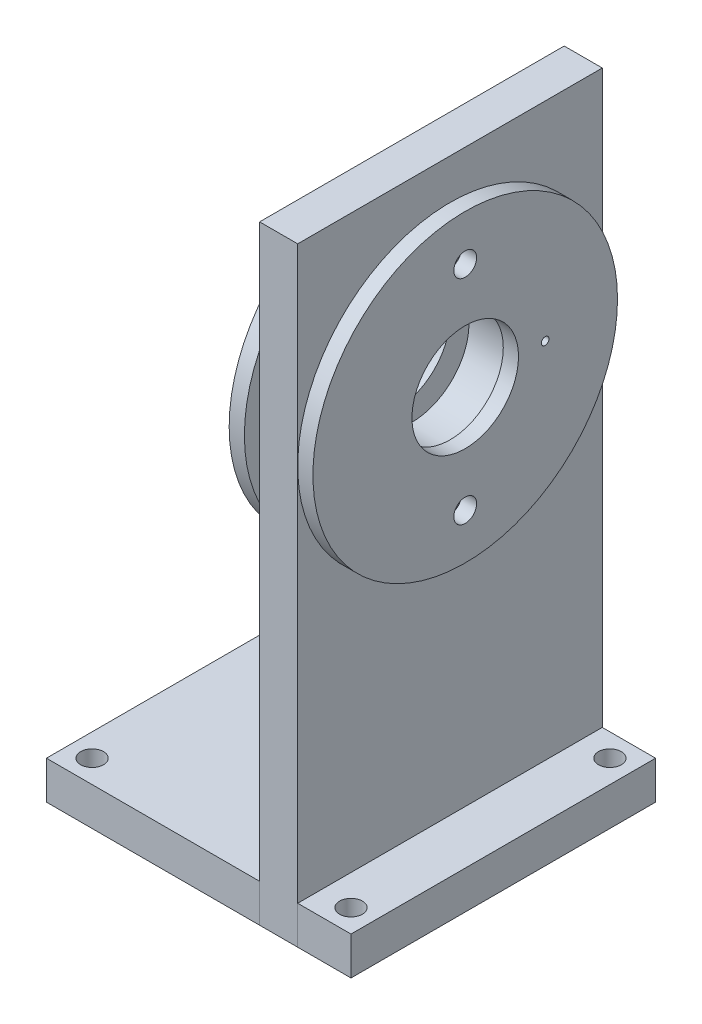
ISO-10303-21;
HEADER;
FILE_DESCRIPTION(('STEP AP214'),'2;1');
FILE_NAME('part.step','',(''),(''),'','','');
FILE_SCHEMA(('AUTOMOTIVE_DESIGN { 1 0 10303 214 1 1 1 1 }'));
ENDSEC;
DATA;
#1=APPLICATION_CONTEXT('core data for automotive mechanical design processes');
#2=APPLICATION_PROTOCOL_DEFINITION('international standard','automotive_design',2000,#1);
#3=PRODUCT_CONTEXT('',#1,'mechanical');
#4=PRODUCT('Part','Part','',(#3));
#5=PRODUCT_RELATED_PRODUCT_CATEGORY('part','',(#4));
#6=PRODUCT_DEFINITION_FORMATION('','',#4);
#7=PRODUCT_DEFINITION_CONTEXT('part definition',#1,'design');
#8=PRODUCT_DEFINITION('design','',#6,#7);
#9=PRODUCT_DEFINITION_SHAPE('','',#8);
#10=(LENGTH_UNIT() NAMED_UNIT(*) SI_UNIT(.MILLI.,.METRE.));
#11=(NAMED_UNIT(*) PLANE_ANGLE_UNIT() SI_UNIT($,.RADIAN.));
#12=(NAMED_UNIT(*) SI_UNIT($,.STERADIAN.) SOLID_ANGLE_UNIT());
#13=UNCERTAINTY_MEASURE_WITH_UNIT(LENGTH_MEASURE(1.E-05),#10,'distance_accuracy_value','');
#14=(GEOMETRIC_REPRESENTATION_CONTEXT(3) GLOBAL_UNCERTAINTY_ASSIGNED_CONTEXT((#13)) GLOBAL_UNIT_ASSIGNED_CONTEXT((#10,
#11,#12)) REPRESENTATION_CONTEXT('',''));
#15=CARTESIAN_POINT('',(0.,0.,0.));
#16=DIRECTION('',(0.,0.,1.));
#17=DIRECTION('',(1.,0.,0.));
#18=AXIS2_PLACEMENT_3D('',#15,#16,#17);
#19=CARTESIAN_POINT('',(0.,5.,20.));
#20=DIRECTION('',(0.,0.,1.));
#21=DIRECTION('',(0.,-1.,0.));
#22=AXIS2_PLACEMENT_3D('',#19,#20,#21);
#23=PLANE('',#22);
#24=DIRECTION('',(-1.,0.,0.));
#25=VECTOR('',#24,1.);
#26=CARTESIAN_POINT('',(0.,0.,20.));
#27=LINE('',#26,#25);
#28=CARTESIAN_POINT('',(12.,0.,20.));
#29=VERTEX_POINT('',#28);
#30=CARTESIAN_POINT('',(-28.,0.,20.));
#31=VERTEX_POINT('',#30);
#32=EDGE_CURVE('E158',#29,#31,#27,.T.);
#33=ORIENTED_EDGE('',*,*,#32,.F.);
#34=DIRECTION('',(0.,-1.,0.));
#35=VECTOR('',#34,1.);
#36=CARTESIAN_POINT('',(12.,5.,20.));
#37=LINE('',#36,#35);
#38=CARTESIAN_POINT('',(12.,5.,20.));
#39=VERTEX_POINT('',#38);
#40=EDGE_CURVE('E12',#39,#29,#37,.T.);
#41=ORIENTED_EDGE('',*,*,#40,.F.);
#42=DIRECTION('',(-1.,0.,0.));
#43=VECTOR('',#42,1.);
#44=CARTESIAN_POINT('',(-28.,5.,20.));
#45=LINE('',#44,#43);
#46=CARTESIAN_POINT('',(-28.,5.,20.));
#47=VERTEX_POINT('',#46);
#48=EDGE_CURVE('E154',#39,#47,#45,.T.);
#49=ORIENTED_EDGE('',*,*,#48,.T.);
#50=DIRECTION('',(0.,-1.,0.));
#51=VECTOR('',#50,1.);
#52=CARTESIAN_POINT('',(-28.,5.,20.));
#53=LINE('',#52,#51);
#54=EDGE_CURVE('E45',#47,#31,#53,.T.);
#55=ORIENTED_EDGE('',*,*,#54,.T.);
#56=EDGE_LOOP('',(#33,#41,#49,#55));
#57=FACE_BOUND('',#56,.T.);
#58=ADVANCED_FACE('F41',(#57),#23,.T.);
#59=CARTESIAN_POINT('',(12.,5.,20.));
#60=DIRECTION('',(1.,0.,0.));
#61=DIRECTION('',(0.,0.,-1.));
#62=AXIS2_PLACEMENT_3D('',#59,#60,#61);
#63=PLANE('',#62);
#64=DIRECTION('',(0.,0.,1.));
#65=VECTOR('',#64,1.);
#66=CARTESIAN_POINT('',(12.,0.,20.));
#67=LINE('',#66,#65);
#68=CARTESIAN_POINT('',(12.,0.,-20.));
#69=VERTEX_POINT('',#68);
#70=EDGE_CURVE('E172',#69,#29,#67,.T.);
#71=ORIENTED_EDGE('',*,*,#70,.F.);
#72=DIRECTION('',(0.,-1.,0.));
#73=VECTOR('',#72,1.);
#74=CARTESIAN_POINT('',(12.,5.,-20.));
#75=LINE('',#74,#73);
#76=CARTESIAN_POINT('',(12.,5.,-20.));
#77=VERTEX_POINT('',#76);
#78=EDGE_CURVE('E50',#77,#69,#75,.T.);
#79=ORIENTED_EDGE('',*,*,#78,.F.);
#80=DIRECTION('',(0.,0.,1.));
#81=VECTOR('',#80,1.);
#82=CARTESIAN_POINT('',(12.,5.,20.));
#83=LINE('',#82,#81);
#84=EDGE_CURVE('E164',#77,#39,#83,.T.);
#85=ORIENTED_EDGE('',*,*,#84,.T.);
#86=ORIENTED_EDGE('',*,*,#40,.T.);
#87=EDGE_LOOP('',(#71,#79,#85,#86));
#88=FACE_BOUND('',#87,.T.);
#89=ADVANCED_FACE('F189',(#88),#63,.T.);
#90=CARTESIAN_POINT('',(12.,5.,-20.));
#91=DIRECTION('',(0.,0.,-1.));
#92=DIRECTION('',(-1.,0.,0.));
#93=AXIS2_PLACEMENT_3D('',#90,#91,#92);
#94=PLANE('',#93);
#95=DIRECTION('',(1.,0.,0.));
#96=VECTOR('',#95,1.);
#97=CARTESIAN_POINT('',(12.,0.,-20.));
#98=LINE('',#97,#96);
#99=CARTESIAN_POINT('',(-28.,0.,-20.));
#100=VERTEX_POINT('',#99);
#101=EDGE_CURVE('E169',#100,#69,#98,.T.);
#102=ORIENTED_EDGE('',*,*,#101,.F.);
#103=DIRECTION('',(0.,-1.,0.));
#104=VECTOR('',#103,1.);
#105=CARTESIAN_POINT('',(-28.,5.,-20.));
#106=LINE('',#105,#104);
#107=CARTESIAN_POINT('',(-28.,5.,-20.));
#108=VERTEX_POINT('',#107);
#109=EDGE_CURVE('E176',#108,#100,#106,.T.);
#110=ORIENTED_EDGE('',*,*,#109,.F.);
#111=DIRECTION('',(1.,0.,0.));
#112=VECTOR('',#111,1.);
#113=CARTESIAN_POINT('',(12.,5.,-20.));
#114=LINE('',#113,#112);
#115=EDGE_CURVE('E161',#108,#77,#114,.T.);
#116=ORIENTED_EDGE('',*,*,#115,.T.);
#117=ORIENTED_EDGE('',*,*,#78,.T.);
#118=EDGE_LOOP('',(#102,#110,#116,#117));
#119=FACE_BOUND('',#118,.T.);
#120=ADVANCED_FACE('F194',(#119),#94,.T.);
#121=CARTESIAN_POINT('',(-28.,5.,-20.));
#122=DIRECTION('',(-1.,0.,0.));
#123=DIRECTION('',(0.,0.,1.));
#124=AXIS2_PLACEMENT_3D('',#121,#122,#123);
#125=PLANE('',#124);
#126=DIRECTION('',(0.,0.,-1.));
#127=VECTOR('',#126,1.);
#128=CARTESIAN_POINT('',(-28.,0.,-20.));
#129=LINE('',#128,#127);
#130=EDGE_CURVE('E151',#31,#100,#129,.T.);
#131=ORIENTED_EDGE('',*,*,#130,.F.);
#132=ORIENTED_EDGE('',*,*,#54,.F.);
#133=DIRECTION('',(0.,0.,-1.));
#134=VECTOR('',#133,1.);
#135=CARTESIAN_POINT('',(-28.,5.,-20.));
#136=LINE('',#135,#134);
#137=EDGE_CURVE('E157',#47,#108,#136,.T.);
#138=ORIENTED_EDGE('',*,*,#137,.T.);
#139=ORIENTED_EDGE('',*,*,#109,.T.);
#140=EDGE_LOOP('',(#131,#132,#138,#139));
#141=FACE_BOUND('',#140,.T.);
#142=ADVANCED_FACE('F43',(#141),#125,.T.);
#143=CARTESIAN_POINT('',(0.,5.,0.));
#144=DIRECTION('',(0.,1.,0.));
#145=DIRECTION('',(0.,0.,1.));
#146=AXIS2_PLACEMENT_3D('',#143,#144,#145);
#147=PLANE('',#146);
#148=CARTESIAN_POINT('',(9.00000000000001,5.,17.));
#149=DIRECTION('',(0.,-1.,0.));
#150=DIRECTION('',(0.,0.,1.));
#151=AXIS2_PLACEMENT_3D('',#148,#149,#150);
#152=CIRCLE('',#151,1.5);
#153=CARTESIAN_POINT('',(9.00000000000001,5.,18.5));
#154=VERTEX_POINT('',#153);
#155=EDGE_CURVE('E243',#154,#154,#152,.T.);
#156=ORIENTED_EDGE('',*,*,#155,.T.);
#157=EDGE_LOOP('',(#156));
#158=FACE_BOUND('',#157,.T.);
#159=CARTESIAN_POINT('',(9.,5.,-17.));
#160=DIRECTION('',(0.,-1.,0.));
#161=DIRECTION('',(0.,0.,-1.));
#162=AXIS2_PLACEMENT_3D('',#159,#160,#161);
#163=CIRCLE('',#162,1.5);
#164=CARTESIAN_POINT('',(9.,5.,-18.5));
#165=VERTEX_POINT('',#164);
#166=EDGE_CURVE('E251',#165,#165,#163,.T.);
#167=ORIENTED_EDGE('',*,*,#166,.T.);
#168=EDGE_LOOP('',(#167));
#169=FACE_BOUND('',#168,.T.);
#170=CARTESIAN_POINT('',(-25.,5.,-17.));
#171=DIRECTION('',(0.,-1.,0.));
#172=DIRECTION('',(0.,0.,1.));
#173=AXIS2_PLACEMENT_3D('',#170,#171,#172);
#174=CIRCLE('',#173,1.5);
#175=CARTESIAN_POINT('',(-25.,5.,-15.5));
#176=VERTEX_POINT('',#175);
#177=EDGE_CURVE('E138',#176,#176,#174,.T.);
#178=ORIENTED_EDGE('',*,*,#177,.T.);
#179=EDGE_LOOP('',(#178));
#180=FACE_BOUND('',#179,.T.);
#181=DIRECTION('',(-1.,0.,0.));
#182=VECTOR('',#181,1.);
#183=CARTESIAN_POINT('',(5.,5.,7.));
#184=LINE('',#183,#182);
#185=CARTESIAN_POINT('',(5.,5.,7.));
#186=VERTEX_POINT('',#185);
#187=CARTESIAN_POINT('',(0.,5.,7.));
#188=VERTEX_POINT('',#187);
#189=EDGE_CURVE('E109',#186,#188,#184,.T.);
#190=ORIENTED_EDGE('',*,*,#189,.T.);
#191=DIRECTION('',(0.,0.,-1.));
#192=VECTOR('',#191,1.);
#193=CARTESIAN_POINT('',(0.,5.,7.));
#194=LINE('',#193,#192);
#195=CARTESIAN_POINT('',(0.,5.,-7.));
#196=VERTEX_POINT('',#195);
#197=EDGE_CURVE('E118',#188,#196,#194,.T.);
#198=ORIENTED_EDGE('',*,*,#197,.T.);
#199=DIRECTION('',(1.,0.,0.));
#200=VECTOR('',#199,1.);
#201=CARTESIAN_POINT('',(0.,5.,-7.));
#202=LINE('',#201,#200);
#203=CARTESIAN_POINT('',(5.,5.,-7.));
#204=VERTEX_POINT('',#203);
#205=EDGE_CURVE('E58',#196,#204,#202,.T.);
#206=ORIENTED_EDGE('',*,*,#205,.T.);
#207=DIRECTION('',(0.,0.,1.));
#208=VECTOR('',#207,1.);
#209=CARTESIAN_POINT('',(5.,5.,-7.));
#210=LINE('',#209,#208);
#211=EDGE_CURVE('E115',#204,#186,#210,.T.);
#212=ORIENTED_EDGE('',*,*,#211,.T.);
#213=EDGE_LOOP('',(#190,#198,#206,#212));
#214=FACE_BOUND('',#213,.T.);
#215=CARTESIAN_POINT('',(-25.,5.,17.));
#216=DIRECTION('',(0.,-1.,0.));
#217=DIRECTION('',(0.,0.,-1.));
#218=AXIS2_PLACEMENT_3D('',#215,#216,#217);
#219=CIRCLE('',#218,1.5);
#220=CARTESIAN_POINT('',(-25.,5.,15.5));
#221=VERTEX_POINT('',#220);
#222=EDGE_CURVE('E148',#221,#221,#219,.T.);
#223=ORIENTED_EDGE('',*,*,#222,.T.);
#224=EDGE_LOOP('',(#223));
#225=FACE_BOUND('',#224,.T.);
#226=ORIENTED_EDGE('',*,*,#48,.F.);
#227=ORIENTED_EDGE('',*,*,#84,.F.);
#228=ORIENTED_EDGE('',*,*,#115,.F.);
#229=ORIENTED_EDGE('',*,*,#137,.F.);
#230=EDGE_LOOP('',(#226,#227,#228,#229));
#231=FACE_BOUND('',#230,.T.);
#232=ADVANCED_FACE('F122',(#158,#169,#180,#214,#225,#231),#147,.T.);
#233=CARTESIAN_POINT('',(0.,0.,0.));
#234=DIRECTION('',(0.,1.,0.));
#235=DIRECTION('',(0.,0.,1.));
#236=AXIS2_PLACEMENT_3D('',#233,#234,#235);
#237=PLANE('',#236);
#238=CARTESIAN_POINT('',(9.00000000000001,0.,17.));
#239=DIRECTION('',(0.,-1.,0.));
#240=DIRECTION('',(0.,0.,1.));
#241=AXIS2_PLACEMENT_3D('',#238,#239,#240);
#242=CIRCLE('',#241,1.5);
#243=CARTESIAN_POINT('',(9.00000000000001,0.,18.5));
#244=VERTEX_POINT('',#243);
#245=EDGE_CURVE('E246',#244,#244,#242,.T.);
#246=ORIENTED_EDGE('',*,*,#245,.F.);
#247=EDGE_LOOP('',(#246));
#248=FACE_BOUND('',#247,.T.);
#249=CARTESIAN_POINT('',(9.,0.,-17.));
#250=DIRECTION('',(0.,-1.,0.));
#251=DIRECTION('',(0.,0.,-1.));
#252=AXIS2_PLACEMENT_3D('',#249,#250,#251);
#253=CIRCLE('',#252,1.5);
#254=CARTESIAN_POINT('',(9.,0.,-18.5));
#255=VERTEX_POINT('',#254);
#256=EDGE_CURVE('E248',#255,#255,#253,.T.);
#257=ORIENTED_EDGE('',*,*,#256,.F.);
#258=EDGE_LOOP('',(#257));
#259=FACE_BOUND('',#258,.T.);
#260=CARTESIAN_POINT('',(-25.,0.,-17.));
#261=DIRECTION('',(0.,-1.,0.));
#262=DIRECTION('',(0.,0.,1.));
#263=AXIS2_PLACEMENT_3D('',#260,#261,#262);
#264=CIRCLE('',#263,1.5);
#265=CARTESIAN_POINT('',(-25.,0.,-15.5));
#266=VERTEX_POINT('',#265);
#267=EDGE_CURVE('E131',#266,#266,#264,.T.);
#268=ORIENTED_EDGE('',*,*,#267,.F.);
#269=EDGE_LOOP('',(#268));
#270=FACE_BOUND('',#269,.T.);
#271=DIRECTION('',(0.,0.,-1.));
#272=VECTOR('',#271,1.);
#273=CARTESIAN_POINT('',(0.,0.,7.));
#274=LINE('',#273,#272);
#275=CARTESIAN_POINT('',(0.,0.,7.));
#276=VERTEX_POINT('',#275);
#277=CARTESIAN_POINT('',(0.,0.,-7.));
#278=VERTEX_POINT('',#277);
#279=EDGE_CURVE('E137',#276,#278,#274,.T.);
#280=ORIENTED_EDGE('',*,*,#279,.F.);
#281=DIRECTION('',(-1.,0.,0.));
#282=VECTOR('',#281,1.);
#283=CARTESIAN_POINT('',(5.,0.,7.));
#284=LINE('',#283,#282);
#285=CARTESIAN_POINT('',(5.,0.,7.));
#286=VERTEX_POINT('',#285);
#287=EDGE_CURVE('E66',#286,#276,#284,.T.);
#288=ORIENTED_EDGE('',*,*,#287,.F.);
#289=DIRECTION('',(0.,0.,1.));
#290=VECTOR('',#289,1.);
#291=CARTESIAN_POINT('',(5.,0.,-7.));
#292=LINE('',#291,#290);
#293=CARTESIAN_POINT('',(5.,0.,-7.));
#294=VERTEX_POINT('',#293);
#295=EDGE_CURVE('E125',#294,#286,#292,.T.);
#296=ORIENTED_EDGE('',*,*,#295,.F.);
#297=DIRECTION('',(1.,0.,0.));
#298=VECTOR('',#297,1.);
#299=CARTESIAN_POINT('',(0.,0.,-7.));
#300=LINE('',#299,#298);
#301=EDGE_CURVE('E128',#278,#294,#300,.T.);
#302=ORIENTED_EDGE('',*,*,#301,.F.);
#303=EDGE_LOOP('',(#280,#288,#296,#302));
#304=FACE_BOUND('',#303,.T.);
#305=CARTESIAN_POINT('',(-25.,0.,17.));
#306=DIRECTION('',(0.,-1.,0.));
#307=DIRECTION('',(0.,0.,-1.));
#308=AXIS2_PLACEMENT_3D('',#305,#306,#307);
#309=CIRCLE('',#308,1.5);
#310=CARTESIAN_POINT('',(-25.,0.,15.5));
#311=VERTEX_POINT('',#310);
#312=EDGE_CURVE('E144',#311,#311,#309,.T.);
#313=ORIENTED_EDGE('',*,*,#312,.F.);
#314=EDGE_LOOP('',(#313));
#315=FACE_BOUND('',#314,.T.);
#316=ORIENTED_EDGE('',*,*,#32,.T.);
#317=ORIENTED_EDGE('',*,*,#130,.T.);
#318=ORIENTED_EDGE('',*,*,#101,.T.);
#319=ORIENTED_EDGE('',*,*,#70,.T.);
#320=EDGE_LOOP('',(#316,#317,#318,#319));
#321=FACE_BOUND('',#320,.T.);
#322=ADVANCED_FACE('F186',(#248,#259,#270,#304,#315,#321),#237,.F.);
#323=CARTESIAN_POINT('',(-25.,5.,17.));
#324=DIRECTION('',(0.,-1.,0.));
#325=DIRECTION('',(0.,0.,-1.));
#326=AXIS2_PLACEMENT_3D('',#323,#324,#325);
#327=CYLINDRICAL_SURFACE('',#326,1.5);
#328=ORIENTED_EDGE('',*,*,#222,.F.);
#329=EDGE_LOOP('',(#328));
#330=FACE_BOUND('',#329,.T.);
#331=ORIENTED_EDGE('',*,*,#312,.T.);
#332=EDGE_LOOP('',(#331));
#333=FACE_BOUND('',#332,.T.);
#334=ADVANCED_FACE('F208',(#330,#333),#327,.F.);
#335=CARTESIAN_POINT('',(5.,5.,7.));
#336=DIRECTION('',(0.,0.,1.));
#337=DIRECTION('',(1.,0.,0.));
#338=AXIS2_PLACEMENT_3D('',#335,#336,#337);
#339=PLANE('',#338);
#340=ORIENTED_EDGE('',*,*,#287,.T.);
#341=DIRECTION('',(0.,-1.,0.));
#342=VECTOR('',#341,1.);
#343=CARTESIAN_POINT('',(0.,5.,7.));
#344=LINE('',#343,#342);
#345=EDGE_CURVE('E105',#188,#276,#344,.T.);
#346=ORIENTED_EDGE('',*,*,#345,.F.);
#347=ORIENTED_EDGE('',*,*,#189,.F.);
#348=DIRECTION('',(0.,-1.,0.));
#349=VECTOR('',#348,1.);
#350=CARTESIAN_POINT('',(5.,5.,7.));
#351=LINE('',#350,#349);
#352=EDGE_CURVE('E142',#186,#286,#351,.T.);
#353=ORIENTED_EDGE('',*,*,#352,.T.);
#354=EDGE_LOOP('',(#340,#346,#347,#353));
#355=FACE_BOUND('',#354,.T.);
#356=ADVANCED_FACE('F107',(#355),#339,.F.);
#357=CARTESIAN_POINT('',(5.,5.,-7.));
#358=DIRECTION('',(1.,0.,0.));
#359=DIRECTION('',(0.,0.,-1.));
#360=AXIS2_PLACEMENT_3D('',#357,#358,#359);
#361=PLANE('',#360);
#362=ORIENTED_EDGE('',*,*,#295,.T.);
#363=ORIENTED_EDGE('',*,*,#352,.F.);
#364=ORIENTED_EDGE('',*,*,#211,.F.);
#365=DIRECTION('',(0.,-1.,0.));
#366=VECTOR('',#365,1.);
#367=CARTESIAN_POINT('',(5.,5.,-7.));
#368=LINE('',#367,#366);
#369=EDGE_CURVE('E145',#204,#294,#368,.T.);
#370=ORIENTED_EDGE('',*,*,#369,.T.);
#371=EDGE_LOOP('',(#362,#363,#364,#370));
#372=FACE_BOUND('',#371,.T.);
#373=ADVANCED_FACE('F218',(#372),#361,.F.);
#374=CARTESIAN_POINT('',(0.,5.,-7.));
#375=DIRECTION('',(0.,0.,-1.));
#376=DIRECTION('',(-1.,0.,0.));
#377=AXIS2_PLACEMENT_3D('',#374,#375,#376);
#378=PLANE('',#377);
#379=ORIENTED_EDGE('',*,*,#301,.T.);
#380=ORIENTED_EDGE('',*,*,#369,.F.);
#381=ORIENTED_EDGE('',*,*,#205,.F.);
#382=DIRECTION('',(0.,-1.,0.));
#383=VECTOR('',#382,1.);
#384=CARTESIAN_POINT('',(0.,5.,-7.));
#385=LINE('',#384,#383);
#386=EDGE_CURVE('E114',#196,#278,#385,.T.);
#387=ORIENTED_EDGE('',*,*,#386,.T.);
#388=EDGE_LOOP('',(#379,#380,#381,#387));
#389=FACE_BOUND('',#388,.T.);
#390=ADVANCED_FACE('F222',(#389),#378,.F.);
#391=CARTESIAN_POINT('',(0.,5.,7.));
#392=DIRECTION('',(-1.,0.,0.));
#393=DIRECTION('',(0.,0.,1.));
#394=AXIS2_PLACEMENT_3D('',#391,#392,#393);
#395=PLANE('',#394);
#396=ORIENTED_EDGE('',*,*,#279,.T.);
#397=ORIENTED_EDGE('',*,*,#386,.F.);
#398=ORIENTED_EDGE('',*,*,#197,.F.);
#399=ORIENTED_EDGE('',*,*,#345,.T.);
#400=EDGE_LOOP('',(#396,#397,#398,#399));
#401=FACE_BOUND('',#400,.T.);
#402=ADVANCED_FACE('F119',(#401),#395,.F.);
#403=CARTESIAN_POINT('',(-25.,5.,-17.));
#404=DIRECTION('',(0.,-1.,0.));
#405=DIRECTION('',(0.,0.,-1.));
#406=AXIS2_PLACEMENT_3D('',#403,#404,#405);
#407=CYLINDRICAL_SURFACE('',#406,1.5);
#408=ORIENTED_EDGE('',*,*,#177,.F.);
#409=EDGE_LOOP('',(#408));
#410=FACE_BOUND('',#409,.T.);
#411=ORIENTED_EDGE('',*,*,#267,.T.);
#412=EDGE_LOOP('',(#411));
#413=FACE_BOUND('',#412,.T.);
#414=ADVANCED_FACE('F221',(#410,#413),#407,.F.);
#415=CARTESIAN_POINT('',(9.,5.,-17.));
#416=DIRECTION('',(0.,-1.,0.));
#417=DIRECTION('',(0.,0.,-1.));
#418=AXIS2_PLACEMENT_3D('',#415,#416,#417);
#419=CYLINDRICAL_SURFACE('',#418,1.5);
#420=ORIENTED_EDGE('',*,*,#166,.F.);
#421=EDGE_LOOP('',(#420));
#422=FACE_BOUND('',#421,.T.);
#423=ORIENTED_EDGE('',*,*,#256,.T.);
#424=EDGE_LOOP('',(#423));
#425=FACE_BOUND('',#424,.T.);
#426=ADVANCED_FACE('F230',(#422,#425),#419,.F.);
#427=CARTESIAN_POINT('',(9.00000000000001,5.,17.));
#428=DIRECTION('',(0.,-1.,0.));
#429=DIRECTION('',(0.,0.,-1.));
#430=AXIS2_PLACEMENT_3D('',#427,#428,#429);
#431=CYLINDRICAL_SURFACE('',#430,1.5);
#432=ORIENTED_EDGE('',*,*,#155,.F.);
#433=EDGE_LOOP('',(#432));
#434=FACE_BOUND('',#433,.T.);
#435=ORIENTED_EDGE('',*,*,#245,.T.);
#436=EDGE_LOOP('',(#435));
#437=FACE_BOUND('',#436,.T.);
#438=ADVANCED_FACE('F234',(#434,#437),#431,.F.);
#439=CLOSED_SHELL('',(#58,#89,#120,#142,#232,#322,#334,#356,#373,#390,#402,#414,#426,#438));
#440=MANIFOLD_SOLID_BREP('B2',#439);
#441=CARTESIAN_POINT('',(-4.,54.7,0.));
#442=DIRECTION('',(-1.,0.,0.));
#443=DIRECTION('',(0.,0.,1.));
#444=AXIS2_PLACEMENT_3D('',#441,#442,#443);
#445=PLANE('',#444);
#446=CARTESIAN_POINT('',(-4.,54.7,-10.5));
#447=DIRECTION('',(-1.,0.,0.));
#448=DIRECTION('',(0.,0.,1.));
#449=AXIS2_PLACEMENT_3D('',#446,#447,#448);
#450=CIRCLE('',#449,1.);
#451=CARTESIAN_POINT('',(-4.,54.7,-9.5));
#452=VERTEX_POINT('',#451);
#453=EDGE_CURVE('E387',#452,#452,#450,.T.);
#454=ORIENTED_EDGE('',*,*,#453,.F.);
#455=EDGE_LOOP('',(#454));
#456=FACE_BOUND('',#455,.T.);
#457=CARTESIAN_POINT('',(-4.,40.7,0.));
#458=DIRECTION('',(-1.,0.,0.));
#459=DIRECTION('',(0.,0.,1.));
#460=AXIS2_PLACEMENT_3D('',#457,#458,#459);
#461=CIRCLE('',#460,1.5);
#462=CARTESIAN_POINT('',(-4.,40.7,1.5));
#463=VERTEX_POINT('',#462);
#464=EDGE_CURVE('E376',#463,#463,#461,.T.);
#465=ORIENTED_EDGE('',*,*,#464,.F.);
#466=EDGE_LOOP('',(#465));
#467=FACE_BOUND('',#466,.T.);
#468=CARTESIAN_POINT('',(-4.,54.7,0.));
#469=DIRECTION('',(-1.,0.,0.));
#470=DIRECTION('',(0.,0.,1.));
#471=AXIS2_PLACEMENT_3D('',#468,#469,#470);
#472=CIRCLE('',#471,20.);
#473=CARTESIAN_POINT('',(-4.,54.7,20.));
#474=VERTEX_POINT('',#473);
#475=EDGE_CURVE('E40',#474,#474,#472,.T.);
#476=ORIENTED_EDGE('',*,*,#475,.T.);
#477=EDGE_LOOP('',(#476));
#478=FACE_BOUND('',#477,.T.);
#479=CARTESIAN_POINT('',(-4.,68.7,0.));
#480=DIRECTION('',(-1.,0.,0.));
#481=DIRECTION('',(0.,0.,1.));
#482=AXIS2_PLACEMENT_3D('',#479,#480,#481);
#483=CIRCLE('',#482,1.5);
#484=CARTESIAN_POINT('',(-4.,68.7,1.5));
#485=VERTEX_POINT('',#484);
#486=EDGE_CURVE('E381',#485,#485,#483,.T.);
#487=ORIENTED_EDGE('',*,*,#486,.F.);
#488=EDGE_LOOP('',(#487));
#489=FACE_BOUND('',#488,.T.);
#490=CARTESIAN_POINT('',(-4.,54.7,0.));
#491=DIRECTION('',(-1.,0.,0.));
#492=DIRECTION('',(0.,0.,1.));
#493=AXIS2_PLACEMENT_3D('',#490,#491,#492);
#494=CIRCLE('',#493,7.);
#495=CARTESIAN_POINT('',(-4.,54.7,7.));
#496=VERTEX_POINT('',#495);
#497=EDGE_CURVE('E393',#496,#496,#494,.T.);
#498=ORIENTED_EDGE('',*,*,#497,.F.);
#499=EDGE_LOOP('',(#498));
#500=FACE_BOUND('',#499,.T.);
#501=ADVANCED_FACE('F365',(#456,#467,#478,#489,#500),#445,.T.);
#502=CARTESIAN_POINT('',(-2.,54.7,0.));
#503=DIRECTION('',(-1.,0.,0.));
#504=DIRECTION('',(0.,0.,1.));
#505=AXIS2_PLACEMENT_3D('',#502,#503,#504);
#506=PLANE('',#505);
#507=CARTESIAN_POINT('',(-2.,54.7,-10.5));
#508=DIRECTION('',(-1.,0.,0.));
#509=DIRECTION('',(0.,0.,1.));
#510=AXIS2_PLACEMENT_3D('',#507,#508,#509);
#511=CIRCLE('',#510,1.);
#512=CARTESIAN_POINT('',(-2.,54.7,-9.5));
#513=VERTEX_POINT('',#512);
#514=EDGE_CURVE('E390',#513,#513,#511,.T.);
#515=ORIENTED_EDGE('',*,*,#514,.T.);
#516=EDGE_LOOP('',(#515));
#517=FACE_BOUND('',#516,.T.);
#518=CARTESIAN_POINT('',(-2.,40.7,0.));
#519=DIRECTION('',(-1.,0.,0.));
#520=DIRECTION('',(0.,0.,1.));
#521=AXIS2_PLACEMENT_3D('',#518,#519,#520);
#522=CIRCLE('',#521,1.5);
#523=CARTESIAN_POINT('',(-2.,40.7,1.5));
#524=VERTEX_POINT('',#523);
#525=EDGE_CURVE('E378',#524,#524,#522,.T.);
#526=ORIENTED_EDGE('',*,*,#525,.T.);
#527=EDGE_LOOP('',(#526));
#528=FACE_BOUND('',#527,.T.);
#529=CARTESIAN_POINT('',(-2.,54.7,0.));
#530=DIRECTION('',(-1.,0.,0.));
#531=DIRECTION('',(0.,0.,1.));
#532=AXIS2_PLACEMENT_3D('',#529,#530,#531);
#533=CIRCLE('',#532,20.);
#534=CARTESIAN_POINT('',(-2.,54.7,20.));
#535=VERTEX_POINT('',#534);
#536=EDGE_CURVE('E369',#535,#535,#533,.T.);
#537=ORIENTED_EDGE('',*,*,#536,.F.);
#538=EDGE_LOOP('',(#537));
#539=FACE_BOUND('',#538,.T.);
#540=CARTESIAN_POINT('',(-2.,68.7,0.));
#541=DIRECTION('',(-1.,0.,0.));
#542=DIRECTION('',(0.,0.,1.));
#543=AXIS2_PLACEMENT_3D('',#540,#541,#542);
#544=CIRCLE('',#543,1.5);
#545=CARTESIAN_POINT('',(-2.,68.7,1.5));
#546=VERTEX_POINT('',#545);
#547=EDGE_CURVE('E384',#546,#546,#544,.T.);
#548=ORIENTED_EDGE('',*,*,#547,.T.);
#549=EDGE_LOOP('',(#548));
#550=FACE_BOUND('',#549,.T.);
#551=CARTESIAN_POINT('',(-2.,54.7,0.));
#552=DIRECTION('',(-1.,0.,0.));
#553=DIRECTION('',(0.,0.,1.));
#554=AXIS2_PLACEMENT_3D('',#551,#552,#553);
#555=CIRCLE('',#554,7.);
#556=CARTESIAN_POINT('',(-2.,54.7,7.));
#557=VERTEX_POINT('',#556);
#558=EDGE_CURVE('E396',#557,#557,#555,.T.);
#559=ORIENTED_EDGE('',*,*,#558,.T.);
#560=EDGE_LOOP('',(#559));
#561=FACE_BOUND('',#560,.T.);
#562=ADVANCED_FACE('F406',(#517,#528,#539,#550,#561),#506,.F.);
#563=CARTESIAN_POINT('',(-4.,54.7,0.));
#564=DIRECTION('',(1.,0.,0.));
#565=DIRECTION('',(0.,0.,-1.));
#566=AXIS2_PLACEMENT_3D('',#563,#564,#565);
#567=CYLINDRICAL_SURFACE('',#566,20.);
#568=ORIENTED_EDGE('',*,*,#475,.F.);
#569=EDGE_LOOP('',(#568));
#570=FACE_BOUND('',#569,.T.);
#571=ORIENTED_EDGE('',*,*,#536,.T.);
#572=EDGE_LOOP('',(#571));
#573=FACE_BOUND('',#572,.T.);
#574=ADVANCED_FACE('F367',(#570,#573),#567,.T.);
#575=CARTESIAN_POINT('',(-4.,40.7,0.));
#576=DIRECTION('',(1.,0.,0.));
#577=DIRECTION('',(0.,0.,-1.));
#578=AXIS2_PLACEMENT_3D('',#575,#576,#577);
#579=CYLINDRICAL_SURFACE('',#578,1.5);
#580=ORIENTED_EDGE('',*,*,#464,.T.);
#581=EDGE_LOOP('',(#580));
#582=FACE_BOUND('',#581,.T.);
#583=ORIENTED_EDGE('',*,*,#525,.F.);
#584=EDGE_LOOP('',(#583));
#585=FACE_BOUND('',#584,.T.);
#586=ADVANCED_FACE('F416',(#582,#585),#579,.F.);
#587=CARTESIAN_POINT('',(-4.,68.7,0.));
#588=DIRECTION('',(1.,0.,0.));
#589=DIRECTION('',(0.,0.,-1.));
#590=AXIS2_PLACEMENT_3D('',#587,#588,#589);
#591=CYLINDRICAL_SURFACE('',#590,1.5);
#592=ORIENTED_EDGE('',*,*,#486,.T.);
#593=EDGE_LOOP('',(#592));
#594=FACE_BOUND('',#593,.T.);
#595=ORIENTED_EDGE('',*,*,#547,.F.);
#596=EDGE_LOOP('',(#595));
#597=FACE_BOUND('',#596,.T.);
#598=ADVANCED_FACE('F419',(#594,#597),#591,.F.);
#599=CARTESIAN_POINT('',(-4.,54.7,-10.5));
#600=DIRECTION('',(1.,0.,0.));
#601=DIRECTION('',(0.,0.,-1.));
#602=AXIS2_PLACEMENT_3D('',#599,#600,#601);
#603=CYLINDRICAL_SURFACE('',#602,1.);
#604=ORIENTED_EDGE('',*,*,#453,.T.);
#605=EDGE_LOOP('',(#604));
#606=FACE_BOUND('',#605,.T.);
#607=ORIENTED_EDGE('',*,*,#514,.F.);
#608=EDGE_LOOP('',(#607));
#609=FACE_BOUND('',#608,.T.);
#610=ADVANCED_FACE('F423',(#606,#609),#603,.F.);
#611=CARTESIAN_POINT('',(-4.,54.7,0.));
#612=DIRECTION('',(1.,0.,0.));
#613=DIRECTION('',(0.,0.,-1.));
#614=AXIS2_PLACEMENT_3D('',#611,#612,#613);
#615=CYLINDRICAL_SURFACE('',#614,7.);
#616=ORIENTED_EDGE('',*,*,#497,.T.);
#617=EDGE_LOOP('',(#616));
#618=FACE_BOUND('',#617,.T.);
#619=ORIENTED_EDGE('',*,*,#558,.F.);
#620=EDGE_LOOP('',(#619));
#621=FACE_BOUND('',#620,.T.);
#622=ADVANCED_FACE('F402',(#618,#621),#615,.F.);
#623=CLOSED_SHELL('',(#501,#562,#574,#586,#598,#610,#622));
#624=MANIFOLD_SOLID_BREP('B6',#623);
#625=CARTESIAN_POINT('',(7.,54.7,0.));
#626=DIRECTION('',(1.,0.,0.));
#627=DIRECTION('',(0.,0.,-1.));
#628=AXIS2_PLACEMENT_3D('',#625,#626,#627);
#629=PLANE('',#628);
#630=CARTESIAN_POINT('',(7.,68.7,0.));
#631=DIRECTION('',(1.,0.,0.));
#632=DIRECTION('',(0.,0.,-1.));
#633=AXIS2_PLACEMENT_3D('',#630,#631,#632);
#634=CIRCLE('',#633,1.5);
#635=CARTESIAN_POINT('',(7.,68.7,-1.5));
#636=VERTEX_POINT('',#635);
#637=EDGE_CURVE('E520',#636,#636,#634,.T.);
#638=ORIENTED_EDGE('',*,*,#637,.F.);
#639=EDGE_LOOP('',(#638));
#640=FACE_BOUND('',#639,.T.);
#641=CARTESIAN_POINT('',(7.,54.7,0.));
#642=DIRECTION('',(1.,0.,0.));
#643=DIRECTION('',(0.,0.,-1.));
#644=AXIS2_PLACEMENT_3D('',#641,#642,#643);
#645=CIRCLE('',#644,7.);
#646=CARTESIAN_POINT('',(7.,54.7,-7.));
#647=VERTEX_POINT('',#646);
#648=EDGE_CURVE('E509',#647,#647,#645,.T.);
#649=ORIENTED_EDGE('',*,*,#648,.F.);
#650=EDGE_LOOP('',(#649));
#651=FACE_BOUND('',#650,.T.);
#652=CARTESIAN_POINT('',(7.,54.7,0.));
#653=DIRECTION('',(1.,0.,0.));
#654=DIRECTION('',(0.,0.,-1.));
#655=AXIS2_PLACEMENT_3D('',#652,#653,#654);
#656=CIRCLE('',#655,20.);
#657=CARTESIAN_POINT('',(7.,54.7,-20.));
#658=VERTEX_POINT('',#657);
#659=EDGE_CURVE('E364',#658,#658,#656,.T.);
#660=ORIENTED_EDGE('',*,*,#659,.T.);
#661=EDGE_LOOP('',(#660));
#662=FACE_BOUND('',#661,.T.);
#663=CARTESIAN_POINT('',(7.,54.7,-10.5));
#664=DIRECTION('',(1.,0.,0.));
#665=DIRECTION('',(0.,0.,-1.));
#666=AXIS2_PLACEMENT_3D('',#663,#664,#665);
#667=CIRCLE('',#666,0.500000000000001);
#668=CARTESIAN_POINT('',(7.,54.7,-11.));
#669=VERTEX_POINT('',#668);
#670=EDGE_CURVE('E514',#669,#669,#667,.T.);
#671=ORIENTED_EDGE('',*,*,#670,.F.);
#672=EDGE_LOOP('',(#671));
#673=FACE_BOUND('',#672,.T.);
#674=CARTESIAN_POINT('',(7.,40.7,0.));
#675=DIRECTION('',(1.,0.,0.));
#676=DIRECTION('',(0.,0.,1.));
#677=AXIS2_PLACEMENT_3D('',#674,#675,#676);
#678=CIRCLE('',#677,1.5);
#679=CARTESIAN_POINT('',(7.,40.7,1.5));
#680=VERTEX_POINT('',#679);
#681=EDGE_CURVE('E526',#680,#680,#678,.T.);
#682=ORIENTED_EDGE('',*,*,#681,.F.);
#683=EDGE_LOOP('',(#682));
#684=FACE_BOUND('',#683,.T.);
#685=ADVANCED_FACE('F498',(#640,#651,#662,#673,#684),#629,.T.);
#686=CARTESIAN_POINT('',(5.,54.7,0.));
#687=DIRECTION('',(1.,0.,0.));
#688=DIRECTION('',(0.,0.,-1.));
#689=AXIS2_PLACEMENT_3D('',#686,#687,#688);
#690=PLANE('',#689);
#691=CARTESIAN_POINT('',(5.,68.7,0.));
#692=DIRECTION('',(1.,0.,0.));
#693=DIRECTION('',(0.,0.,-1.));
#694=AXIS2_PLACEMENT_3D('',#691,#692,#693);
#695=CIRCLE('',#694,1.5);
#696=CARTESIAN_POINT('',(5.,68.7,-1.5));
#697=VERTEX_POINT('',#696);
#698=EDGE_CURVE('E523',#697,#697,#695,.T.);
#699=ORIENTED_EDGE('',*,*,#698,.T.);
#700=EDGE_LOOP('',(#699));
#701=FACE_BOUND('',#700,.T.);
#702=CARTESIAN_POINT('',(5.,54.7,0.));
#703=DIRECTION('',(1.,0.,0.));
#704=DIRECTION('',(0.,0.,-1.));
#705=AXIS2_PLACEMENT_3D('',#702,#703,#704);
#706=CIRCLE('',#705,7.);
#707=CARTESIAN_POINT('',(5.,54.7,-7.));
#708=VERTEX_POINT('',#707);
#709=EDGE_CURVE('E511',#708,#708,#706,.T.);
#710=ORIENTED_EDGE('',*,*,#709,.T.);
#711=EDGE_LOOP('',(#710));
#712=FACE_BOUND('',#711,.T.);
#713=CARTESIAN_POINT('',(5.,54.7,0.));
#714=DIRECTION('',(1.,0.,0.));
#715=DIRECTION('',(0.,0.,-1.));
#716=AXIS2_PLACEMENT_3D('',#713,#714,#715);
#717=CIRCLE('',#716,20.);
#718=CARTESIAN_POINT('',(5.,54.7,-20.));
#719=VERTEX_POINT('',#718);
#720=EDGE_CURVE('E502',#719,#719,#717,.T.);
#721=ORIENTED_EDGE('',*,*,#720,.F.);
#722=EDGE_LOOP('',(#721));
#723=FACE_BOUND('',#722,.T.);
#724=CARTESIAN_POINT('',(5.,54.7,-10.5));
#725=DIRECTION('',(1.,0.,0.));
#726=DIRECTION('',(0.,0.,-1.));
#727=AXIS2_PLACEMENT_3D('',#724,#725,#726);
#728=CIRCLE('',#727,0.500000000000001);
#729=CARTESIAN_POINT('',(5.,54.7,-11.));
#730=VERTEX_POINT('',#729);
#731=EDGE_CURVE('E517',#730,#730,#728,.T.);
#732=ORIENTED_EDGE('',*,*,#731,.T.);
#733=EDGE_LOOP('',(#732));
#734=FACE_BOUND('',#733,.T.);
#735=CARTESIAN_POINT('',(5.,40.7,0.));
#736=DIRECTION('',(1.,0.,0.));
#737=DIRECTION('',(0.,0.,1.));
#738=AXIS2_PLACEMENT_3D('',#735,#736,#737);
#739=CIRCLE('',#738,1.5);
#740=CARTESIAN_POINT('',(5.,40.7,1.5));
#741=VERTEX_POINT('',#740);
#742=EDGE_CURVE('E529',#741,#741,#739,.T.);
#743=ORIENTED_EDGE('',*,*,#742,.T.);
#744=EDGE_LOOP('',(#743));
#745=FACE_BOUND('',#744,.T.);
#746=ADVANCED_FACE('F539',(#701,#712,#723,#734,#745),#690,.F.);
#747=CARTESIAN_POINT('',(7.,54.7,0.));
#748=DIRECTION('',(-1.,0.,0.));
#749=DIRECTION('',(0.,0.,1.));
#750=AXIS2_PLACEMENT_3D('',#747,#748,#749);
#751=CYLINDRICAL_SURFACE('',#750,20.);
#752=ORIENTED_EDGE('',*,*,#659,.F.);
#753=EDGE_LOOP('',(#752));
#754=FACE_BOUND('',#753,.T.);
#755=ORIENTED_EDGE('',*,*,#720,.T.);
#756=EDGE_LOOP('',(#755));
#757=FACE_BOUND('',#756,.T.);
#758=ADVANCED_FACE('F500',(#754,#757),#751,.T.);
#759=CARTESIAN_POINT('',(7.,54.7,0.));
#760=DIRECTION('',(-1.,0.,0.));
#761=DIRECTION('',(0.,0.,1.));
#762=AXIS2_PLACEMENT_3D('',#759,#760,#761);
#763=CYLINDRICAL_SURFACE('',#762,7.);
#764=ORIENTED_EDGE('',*,*,#648,.T.);
#765=EDGE_LOOP('',(#764));
#766=FACE_BOUND('',#765,.T.);
#767=ORIENTED_EDGE('',*,*,#709,.F.);
#768=EDGE_LOOP('',(#767));
#769=FACE_BOUND('',#768,.T.);
#770=ADVANCED_FACE('F549',(#766,#769),#763,.F.);
#771=CARTESIAN_POINT('',(7.,54.7,-10.5));
#772=DIRECTION('',(-1.,0.,0.));
#773=DIRECTION('',(0.,0.,1.));
#774=AXIS2_PLACEMENT_3D('',#771,#772,#773);
#775=CYLINDRICAL_SURFACE('',#774,0.500000000000001);
#776=ORIENTED_EDGE('',*,*,#670,.T.);
#777=EDGE_LOOP('',(#776));
#778=FACE_BOUND('',#777,.T.);
#779=ORIENTED_EDGE('',*,*,#731,.F.);
#780=EDGE_LOOP('',(#779));
#781=FACE_BOUND('',#780,.T.);
#782=ADVANCED_FACE('F552',(#778,#781),#775,.F.);
#783=CARTESIAN_POINT('',(7.,68.7,0.));
#784=DIRECTION('',(-1.,0.,0.));
#785=DIRECTION('',(0.,0.,1.));
#786=AXIS2_PLACEMENT_3D('',#783,#784,#785);
#787=CYLINDRICAL_SURFACE('',#786,1.5);
#788=ORIENTED_EDGE('',*,*,#637,.T.);
#789=EDGE_LOOP('',(#788));
#790=FACE_BOUND('',#789,.T.);
#791=ORIENTED_EDGE('',*,*,#698,.F.);
#792=EDGE_LOOP('',(#791));
#793=FACE_BOUND('',#792,.T.);
#794=ADVANCED_FACE('F556',(#790,#793),#787,.F.);
#795=CARTESIAN_POINT('',(7.,40.7,0.));
#796=DIRECTION('',(-1.,0.,0.));
#797=DIRECTION('',(0.,0.,1.));
#798=AXIS2_PLACEMENT_3D('',#795,#796,#797);
#799=CYLINDRICAL_SURFACE('',#798,1.5);
#800=ORIENTED_EDGE('',*,*,#681,.T.);
#801=EDGE_LOOP('',(#800));
#802=FACE_BOUND('',#801,.T.);
#803=ORIENTED_EDGE('',*,*,#742,.F.);
#804=EDGE_LOOP('',(#803));
#805=FACE_BOUND('',#804,.T.);
#806=ADVANCED_FACE('F535',(#802,#805),#799,.F.);
#807=CLOSED_SHELL('',(#685,#746,#758,#770,#782,#794,#806));
#808=MANIFOLD_SOLID_BREP('B35',#807);
#809=CARTESIAN_POINT('',(5.,0.,0.));
#810=DIRECTION('',(-1.,0.,0.));
#811=DIRECTION('',(0.,0.,1.));
#812=AXIS2_PLACEMENT_3D('',#809,#810,#811);
#813=PLANE('',#812);
#814=CARTESIAN_POINT('',(5.,54.7,0.));
#815=DIRECTION('',(1.,0.,0.));
#816=DIRECTION('',(0.,0.,-1.));
#817=AXIS2_PLACEMENT_3D('',#814,#815,#816);
#818=CIRCLE('',#817,7.5);
#819=CARTESIAN_POINT('',(5.,54.7,-7.5));
#820=VERTEX_POINT('',#819);
#821=EDGE_CURVE('E688',#820,#820,#818,.T.);
#822=ORIENTED_EDGE('',*,*,#821,.F.);
#823=EDGE_LOOP('',(#822));
#824=FACE_BOUND('',#823,.T.);
#825=DIRECTION('',(0.,0.,-1.));
#826=VECTOR('',#825,1.);
#827=CARTESIAN_POINT('',(5.,0.,-20.));
#828=LINE('',#827,#826);
#829=CARTESIAN_POINT('',(5.,0.,20.));
#830=VERTEX_POINT('',#829);
#831=CARTESIAN_POINT('',(5.,0.,-20.));
#832=VERTEX_POINT('',#831);
#833=EDGE_CURVE('E639',#830,#832,#828,.T.);
#834=ORIENTED_EDGE('',*,*,#833,.T.);
#835=DIRECTION('',(0.,1.,0.));
#836=VECTOR('',#835,1.);
#837=CARTESIAN_POINT('',(5.,80.,-20.));
#838=LINE('',#837,#836);
#839=CARTESIAN_POINT('',(5.,80.,-20.));
#840=VERTEX_POINT('',#839);
#841=EDGE_CURVE('E670',#832,#840,#838,.T.);
#842=ORIENTED_EDGE('',*,*,#841,.T.);
#843=DIRECTION('',(0.,0.,1.));
#844=VECTOR('',#843,1.);
#845=CARTESIAN_POINT('',(5.,80.,20.));
#846=LINE('',#845,#844);
#847=CARTESIAN_POINT('',(5.,80.,20.));
#848=VERTEX_POINT('',#847);
#849=EDGE_CURVE('E674',#840,#848,#846,.T.);
#850=ORIENTED_EDGE('',*,*,#849,.T.);
#851=DIRECTION('',(0.,-1.,0.));
#852=VECTOR('',#851,1.);
#853=CARTESIAN_POINT('',(5.,0.,20.));
#854=LINE('',#853,#852);
#855=EDGE_CURVE('E681',#848,#830,#854,.T.);
#856=ORIENTED_EDGE('',*,*,#855,.T.);
#857=EDGE_LOOP('',(#834,#842,#850,#856));
#858=FACE_BOUND('',#857,.T.);
#859=CARTESIAN_POINT('',(5.,54.7,-10.5));
#860=DIRECTION('',(1.,0.,0.));
#861=DIRECTION('',(0.,0.,-1.));
#862=AXIS2_PLACEMENT_3D('',#859,#860,#861);
#863=CIRCLE('',#862,1.);
#864=CARTESIAN_POINT('',(5.,54.7,-11.5));
#865=VERTEX_POINT('',#864);
#866=EDGE_CURVE('E728',#865,#865,#863,.T.);
#867=ORIENTED_EDGE('',*,*,#866,.F.);
#868=EDGE_LOOP('',(#867));
#869=FACE_BOUND('',#868,.T.);
#870=ADVANCED_FACE('F622',(#824,#858,#869),#813,.F.);
#871=CARTESIAN_POINT('',(0.,0.,0.));
#872=DIRECTION('',(-1.,0.,0.));
#873=DIRECTION('',(0.,0.,1.));
#874=AXIS2_PLACEMENT_3D('',#871,#872,#873);
#875=PLANE('',#874);
#876=CARTESIAN_POINT('',(0.,54.7,0.));
#877=DIRECTION('',(1.,0.,0.));
#878=DIRECTION('',(0.,0.,-1.));
#879=AXIS2_PLACEMENT_3D('',#876,#877,#878);
#880=CIRCLE('',#879,7.5);
#881=CARTESIAN_POINT('',(0.,54.7,-7.5));
#882=VERTEX_POINT('',#881);
#883=EDGE_CURVE('E733',#882,#882,#880,.T.);
#884=ORIENTED_EDGE('',*,*,#883,.T.);
#885=EDGE_LOOP('',(#884));
#886=FACE_BOUND('',#885,.T.);
#887=DIRECTION('',(0.,1.,0.));
#888=VECTOR('',#887,1.);
#889=CARTESIAN_POINT('',(0.,80.,-20.));
#890=LINE('',#889,#888);
#891=CARTESIAN_POINT('',(0.,0.,-20.));
#892=VERTEX_POINT('',#891);
#893=CARTESIAN_POINT('',(0.,80.,-20.));
#894=VERTEX_POINT('',#893);
#895=EDGE_CURVE('E677',#892,#894,#890,.T.);
#896=ORIENTED_EDGE('',*,*,#895,.F.);
#897=DIRECTION('',(0.,0.,-1.));
#898=VECTOR('',#897,1.);
#899=CARTESIAN_POINT('',(0.,0.,0.));
#900=LINE('',#899,#898);
#901=CARTESIAN_POINT('',(0.,0.,20.));
#902=VERTEX_POINT('',#901);
#903=EDGE_CURVE('E691',#902,#892,#900,.T.);
#904=ORIENTED_EDGE('',*,*,#903,.F.);
#905=DIRECTION('',(0.,-1.,0.));
#906=VECTOR('',#905,1.);
#907=CARTESIAN_POINT('',(0.,0.,20.));
#908=LINE('',#907,#906);
#909=CARTESIAN_POINT('',(0.,80.,20.));
#910=VERTEX_POINT('',#909);
#911=EDGE_CURVE('E664',#910,#902,#908,.T.);
#912=ORIENTED_EDGE('',*,*,#911,.F.);
#913=DIRECTION('',(0.,0.,1.));
#914=VECTOR('',#913,1.);
#915=CARTESIAN_POINT('',(0.,80.,20.));
#916=LINE('',#915,#914);
#917=EDGE_CURVE('E657',#894,#910,#916,.T.);
#918=ORIENTED_EDGE('',*,*,#917,.F.);
#919=EDGE_LOOP('',(#896,#904,#912,#918));
#920=FACE_BOUND('',#919,.T.);
#921=CARTESIAN_POINT('',(0.,54.7,-10.5));
#922=DIRECTION('',(1.,0.,0.));
#923=DIRECTION('',(0.,0.,-1.));
#924=AXIS2_PLACEMENT_3D('',#921,#922,#923);
#925=CIRCLE('',#924,1.);
#926=CARTESIAN_POINT('',(0.,54.7,-11.5));
#927=VERTEX_POINT('',#926);
#928=EDGE_CURVE('E731',#927,#927,#925,.T.);
#929=ORIENTED_EDGE('',*,*,#928,.T.);
#930=EDGE_LOOP('',(#929));
#931=FACE_BOUND('',#930,.T.);
#932=ADVANCED_FACE('F697',(#886,#920,#931),#875,.T.);
#933=CARTESIAN_POINT('',(5.,80.,-20.));
#934=DIRECTION('',(0.,0.,1.));
#935=DIRECTION('',(1.,0.,0.));
#936=AXIS2_PLACEMENT_3D('',#933,#934,#935);
#937=PLANE('',#936);
#938=ORIENTED_EDGE('',*,*,#895,.T.);
#939=DIRECTION('',(-1.,0.,0.));
#940=VECTOR('',#939,1.);
#941=CARTESIAN_POINT('',(5.,80.,-20.));
#942=LINE('',#941,#940);
#943=EDGE_CURVE('E631',#840,#894,#942,.T.);
#944=ORIENTED_EDGE('',*,*,#943,.F.);
#945=ORIENTED_EDGE('',*,*,#841,.F.);
#946=DIRECTION('',(-1.,0.,0.));
#947=VECTOR('',#946,1.);
#948=CARTESIAN_POINT('',(5.,0.,-20.));
#949=LINE('',#948,#947);
#950=EDGE_CURVE('E496',#832,#892,#949,.T.);
#951=ORIENTED_EDGE('',*,*,#950,.T.);
#952=EDGE_LOOP('',(#938,#944,#945,#951));
#953=FACE_BOUND('',#952,.T.);
#954=ADVANCED_FACE('F624',(#953),#937,.F.);
#955=CARTESIAN_POINT('',(5.,80.,20.));
#956=DIRECTION('',(0.,-1.,0.));
#957=DIRECTION('',(0.,0.,-1.));
#958=AXIS2_PLACEMENT_3D('',#955,#956,#957);
#959=PLANE('',#958);
#960=ORIENTED_EDGE('',*,*,#917,.T.);
#961=DIRECTION('',(-1.,0.,0.));
#962=VECTOR('',#961,1.);
#963=CARTESIAN_POINT('',(5.,80.,20.));
#964=LINE('',#963,#962);
#965=EDGE_CURVE('E678',#848,#910,#964,.T.);
#966=ORIENTED_EDGE('',*,*,#965,.F.);
#967=ORIENTED_EDGE('',*,*,#849,.F.);
#968=ORIENTED_EDGE('',*,*,#943,.T.);
#969=EDGE_LOOP('',(#960,#966,#967,#968));
#970=FACE_BOUND('',#969,.T.);
#971=ADVANCED_FACE('F679',(#970),#959,.F.);
#972=CARTESIAN_POINT('',(5.,0.,20.));
#973=DIRECTION('',(0.,0.,-1.));
#974=DIRECTION('',(-1.,0.,0.));
#975=AXIS2_PLACEMENT_3D('',#972,#973,#974);
#976=PLANE('',#975);
#977=ORIENTED_EDGE('',*,*,#911,.T.);
#978=DIRECTION('',(-1.,0.,0.));
#979=VECTOR('',#978,1.);
#980=CARTESIAN_POINT('',(5.,0.,20.));
#981=LINE('',#980,#979);
#982=EDGE_CURVE('E683',#830,#902,#981,.T.);
#983=ORIENTED_EDGE('',*,*,#982,.F.);
#984=ORIENTED_EDGE('',*,*,#855,.F.);
#985=ORIENTED_EDGE('',*,*,#965,.T.);
#986=EDGE_LOOP('',(#977,#983,#984,#985));
#987=FACE_BOUND('',#986,.T.);
#988=ADVANCED_FACE('F694',(#987),#976,.F.);
#989=CARTESIAN_POINT('',(5.,0.,0.));
#990=DIRECTION('',(0.,1.,0.));
#991=DIRECTION('',(0.,0.,1.));
#992=AXIS2_PLACEMENT_3D('',#989,#990,#991);
#993=PLANE('',#992);
#994=ORIENTED_EDGE('',*,*,#903,.T.);
#995=ORIENTED_EDGE('',*,*,#950,.F.);
#996=ORIENTED_EDGE('',*,*,#833,.F.);
#997=ORIENTED_EDGE('',*,*,#982,.T.);
#998=EDGE_LOOP('',(#994,#995,#996,#997));
#999=FACE_BOUND('',#998,.T.);
#1000=ADVANCED_FACE('F699',(#999),#993,.F.);
#1001=CARTESIAN_POINT('',(5.,54.7,0.));
#1002=DIRECTION('',(-1.,0.,0.));
#1003=DIRECTION('',(0.,0.,1.));
#1004=AXIS2_PLACEMENT_3D('',#1001,#1002,#1003);
#1005=CYLINDRICAL_SURFACE('',#1004,7.5);
#1006=ORIENTED_EDGE('',*,*,#821,.T.);
#1007=EDGE_LOOP('',(#1006));
#1008=FACE_BOUND('',#1007,.T.);
#1009=ORIENTED_EDGE('',*,*,#883,.F.);
#1010=EDGE_LOOP('',(#1009));
#1011=FACE_BOUND('',#1010,.T.);
#1012=ADVANCED_FACE('F701',(#1008,#1011),#1005,.F.);
#1013=CARTESIAN_POINT('',(5.,54.7,-10.5));
#1014=DIRECTION('',(-1.,0.,0.));
#1015=DIRECTION('',(0.,0.,1.));
#1016=AXIS2_PLACEMENT_3D('',#1013,#1014,#1015);
#1017=CYLINDRICAL_SURFACE('',#1016,1.);
#1018=ORIENTED_EDGE('',*,*,#866,.T.);
#1019=EDGE_LOOP('',(#1018));
#1020=FACE_BOUND('',#1019,.T.);
#1021=ORIENTED_EDGE('',*,*,#928,.F.);
#1022=EDGE_LOOP('',(#1021));
#1023=FACE_BOUND('',#1022,.T.);
#1024=ADVANCED_FACE('F707',(#1020,#1023),#1017,.F.);
#1025=CLOSED_SHELL('',(#870,#932,#954,#971,#988,#1000,#1012,#1024));
#1026=MANIFOLD_SOLID_BREP('B359',#1025);
#1027=ADVANCED_BREP_SHAPE_REPRESENTATION('',(#18,#440,#624,#808,#1026),#14);
#1028=SHAPE_DEFINITION_REPRESENTATION(#9,#1027);
ENDSEC;
END-ISO-10303-21;
